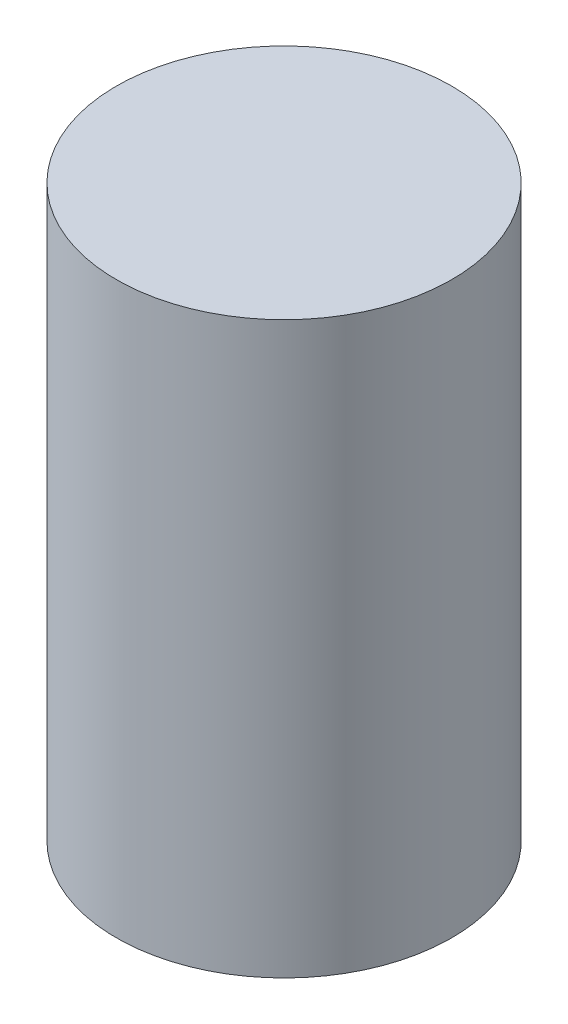
ISO-10303-21;
HEADER;
FILE_DESCRIPTION(('STEP AP214'),'2;1');
FILE_NAME('part.step','',(''),(''),'','','');
FILE_SCHEMA(('AUTOMOTIVE_DESIGN { 1 0 10303 214 1 1 1 1 }'));
ENDSEC;
DATA;
#1=APPLICATION_CONTEXT('core data for automotive mechanical design processes');
#2=APPLICATION_PROTOCOL_DEFINITION('international standard','automotive_design',2000,#1);
#3=PRODUCT_CONTEXT('',#1,'mechanical');
#4=PRODUCT('Part','Part','',(#3));
#5=PRODUCT_RELATED_PRODUCT_CATEGORY('part','',(#4));
#6=PRODUCT_DEFINITION_FORMATION('','',#4);
#7=PRODUCT_DEFINITION_CONTEXT('part definition',#1,'design');
#8=PRODUCT_DEFINITION('design','',#6,#7);
#9=PRODUCT_DEFINITION_SHAPE('','',#8);
#10=(LENGTH_UNIT() NAMED_UNIT(*) SI_UNIT(.MILLI.,.METRE.));
#11=(NAMED_UNIT(*) PLANE_ANGLE_UNIT() SI_UNIT($,.RADIAN.));
#12=(NAMED_UNIT(*) SI_UNIT($,.STERADIAN.) SOLID_ANGLE_UNIT());
#13=UNCERTAINTY_MEASURE_WITH_UNIT(LENGTH_MEASURE(1.E-05),#10,'distance_accuracy_value','');
#14=(GEOMETRIC_REPRESENTATION_CONTEXT(3) GLOBAL_UNCERTAINTY_ASSIGNED_CONTEXT((#13)) GLOBAL_UNIT_ASSIGNED_CONTEXT((#10,
#11,#12)) REPRESENTATION_CONTEXT('',''));
#15=CARTESIAN_POINT('',(0.,0.,0.));
#16=DIRECTION('',(0.,0.,1.));
#17=DIRECTION('',(1.,0.,0.));
#18=AXIS2_PLACEMENT_3D('',#15,#16,#17);
#19=CARTESIAN_POINT('',(0.,190.,18.));
#20=DIRECTION('',(0.,-1.,0.));
#21=DIRECTION('',(0.,0.,-1.));
#22=AXIS2_PLACEMENT_3D('',#19,#20,#21);
#23=PLANE('',#22);
#24=CARTESIAN_POINT('',(0.,190.,18.));
#25=DIRECTION('',(0.,-1.,0.));
#26=DIRECTION('',(0.,0.,-1.));
#27=AXIS2_PLACEMENT_3D('',#24,#25,#26);
#28=CIRCLE('',#27,5.);
#29=CARTESIAN_POINT('',(0.,190.,13.));
#30=VERTEX_POINT('',#29);
#31=EDGE_CURVE('E18',#30,#30,#28,.F.);
#32=ORIENTED_EDGE('',*,*,#31,.F.);
#33=EDGE_LOOP('',(#32));
#34=FACE_BOUND('',#33,.T.);
#35=ADVANCED_FACE('F15',(#34),#23,.T.);
#36=CARTESIAN_POINT('',(0.,207.,18.));
#37=DIRECTION('',(0.,1.,0.));
#38=DIRECTION('',(0.,0.,1.));
#39=AXIS2_PLACEMENT_3D('',#36,#37,#38);
#40=PLANE('',#39);
#41=CARTESIAN_POINT('',(0.,207.,18.));
#42=DIRECTION('',(0.,-1.,0.));
#43=DIRECTION('',(0.,0.,-1.));
#44=AXIS2_PLACEMENT_3D('',#41,#42,#43);
#45=CIRCLE('',#44,5.);
#46=CARTESIAN_POINT('',(0.,207.,13.));
#47=VERTEX_POINT('',#46);
#48=EDGE_CURVE('E10',#47,#47,#45,.T.);
#49=ORIENTED_EDGE('',*,*,#48,.F.);
#50=EDGE_LOOP('',(#49));
#51=FACE_BOUND('',#50,.T.);
#52=ADVANCED_FACE('F30',(#51),#40,.T.);
#53=CARTESIAN_POINT('',(0.,198.5,18.));
#54=DIRECTION('',(0.,-1.,0.));
#55=DIRECTION('',(0.,0.,-1.));
#56=AXIS2_PLACEMENT_3D('',#53,#54,#55);
#57=CYLINDRICAL_SURFACE('',#56,5.);
#58=ORIENTED_EDGE('',*,*,#31,.T.);
#59=EDGE_LOOP('',(#58));
#60=FACE_BOUND('',#59,.T.);
#61=ORIENTED_EDGE('',*,*,#48,.T.);
#62=EDGE_LOOP('',(#61));
#63=FACE_BOUND('',#62,.T.);
#64=ADVANCED_FACE('F27',(#60,#63),#57,.T.);
#65=CLOSED_SHELL('',(#35,#52,#64));
#66=MANIFOLD_SOLID_BREP('B1',#65);
#67=ADVANCED_BREP_SHAPE_REPRESENTATION('',(#18,#66),#14);
#68=SHAPE_DEFINITION_REPRESENTATION(#9,#67);
ENDSEC;
END-ISO-10303-21;
